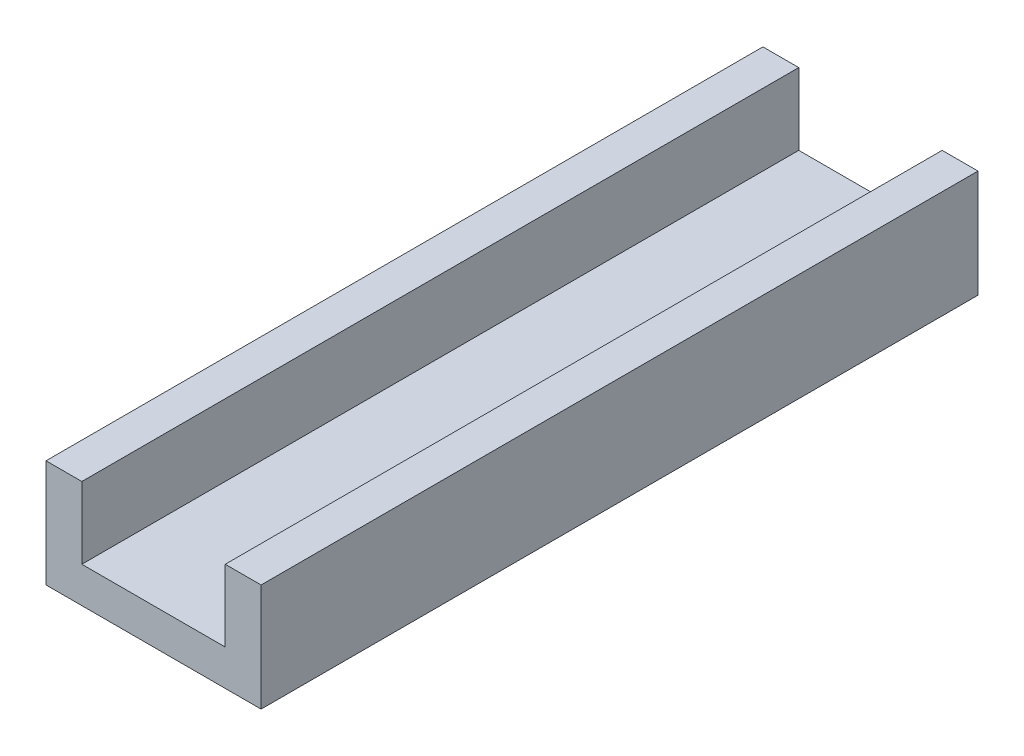
ISO-10303-21;
HEADER;
FILE_DESCRIPTION(('STEP AP214'),'2;1');
FILE_NAME('part.step','',(''),(''),'','','');
FILE_SCHEMA(('AUTOMOTIVE_DESIGN { 1 0 10303 214 1 1 1 1 }'));
ENDSEC;
DATA;
#1=APPLICATION_CONTEXT('core data for automotive mechanical design processes');
#2=APPLICATION_PROTOCOL_DEFINITION('international standard','automotive_design',2000,#1);
#3=PRODUCT_CONTEXT('',#1,'mechanical');
#4=PRODUCT('Part','Part','',(#3));
#5=PRODUCT_RELATED_PRODUCT_CATEGORY('part','',(#4));
#6=PRODUCT_DEFINITION_FORMATION('','',#4);
#7=PRODUCT_DEFINITION_CONTEXT('part definition',#1,'design');
#8=PRODUCT_DEFINITION('design','',#6,#7);
#9=PRODUCT_DEFINITION_SHAPE('','',#8);
#10=(LENGTH_UNIT() NAMED_UNIT(*) SI_UNIT(.MILLI.,.METRE.));
#11=(NAMED_UNIT(*) PLANE_ANGLE_UNIT() SI_UNIT($,.RADIAN.));
#12=(NAMED_UNIT(*) SI_UNIT($,.STERADIAN.) SOLID_ANGLE_UNIT());
#13=UNCERTAINTY_MEASURE_WITH_UNIT(LENGTH_MEASURE(1.E-05),#10,'distance_accuracy_value','');
#14=(GEOMETRIC_REPRESENTATION_CONTEXT(3) GLOBAL_UNCERTAINTY_ASSIGNED_CONTEXT((#13)) GLOBAL_UNIT_ASSIGNED_CONTEXT((#10,
#11,#12)) REPRESENTATION_CONTEXT('',''));
#15=CARTESIAN_POINT('',(0.,0.,0.));
#16=DIRECTION('',(0.,0.,1.));
#17=DIRECTION('',(1.,0.,0.));
#18=AXIS2_PLACEMENT_3D('',#15,#16,#17);
#19=CARTESIAN_POINT('',(60.,0.,200.));
#20=DIRECTION('',(-1.,0.,0.));
#21=DIRECTION('',(0.,0.,1.));
#22=AXIS2_PLACEMENT_3D('',#19,#20,#21);
#23=PLANE('',#22);
#24=DIRECTION('',(0.,1.,0.));
#25=VECTOR('',#24,1.);
#26=CARTESIAN_POINT('',(60.,0.,0.));
#27=LINE('',#26,#25);
#28=CARTESIAN_POINT('',(60.,0.,0.));
#29=VERTEX_POINT('',#28);
#30=CARTESIAN_POINT('',(60.,30.,0.));
#31=VERTEX_POINT('',#30);
#32=EDGE_CURVE('E130',#29,#31,#27,.T.);
#33=ORIENTED_EDGE('',*,*,#32,.T.);
#34=DIRECTION('',(0.,0.,-1.));
#35=VECTOR('',#34,1.);
#36=CARTESIAN_POINT('',(60.,30.,200.));
#37=LINE('',#36,#35);
#38=CARTESIAN_POINT('',(60.,30.,200.));
#39=VERTEX_POINT('',#38);
#40=EDGE_CURVE('E11',#39,#31,#37,.T.);
#41=ORIENTED_EDGE('',*,*,#40,.F.);
#42=DIRECTION('',(0.,1.,0.));
#43=VECTOR('',#42,1.);
#44=CARTESIAN_POINT('',(60.,0.,200.));
#45=LINE('',#44,#43);
#46=CARTESIAN_POINT('',(60.,0.,200.));
#47=VERTEX_POINT('',#46);
#48=EDGE_CURVE('E88',#47,#39,#45,.T.);
#49=ORIENTED_EDGE('',*,*,#48,.F.);
#50=DIRECTION('',(0.,0.,-1.));
#51=VECTOR('',#50,1.);
#52=CARTESIAN_POINT('',(60.,0.,200.));
#53=LINE('',#52,#51);
#54=EDGE_CURVE('E129',#47,#29,#53,.T.);
#55=ORIENTED_EDGE('',*,*,#54,.T.);
#56=EDGE_LOOP('',(#33,#41,#49,#55));
#57=FACE_BOUND('',#56,.T.);
#58=ADVANCED_FACE('F33',(#57),#23,.F.);
#59=CARTESIAN_POINT('',(50.,30.,200.));
#60=DIRECTION('',(0.,1.,0.));
#61=DIRECTION('',(0.,0.,1.));
#62=AXIS2_PLACEMENT_3D('',#59,#60,#61);
#63=PLANE('',#62);
#64=DIRECTION('',(1.,0.,0.));
#65=VECTOR('',#64,1.);
#66=CARTESIAN_POINT('',(50.,30.,0.));
#67=LINE('',#66,#65);
#68=CARTESIAN_POINT('',(50.,30.,0.));
#69=VERTEX_POINT('',#68);
#70=EDGE_CURVE('E133',#69,#31,#67,.T.);
#71=ORIENTED_EDGE('',*,*,#70,.F.);
#72=DIRECTION('',(0.,0.,-1.));
#73=VECTOR('',#72,1.);
#74=CARTESIAN_POINT('',(50.,30.,200.));
#75=LINE('',#74,#73);
#76=CARTESIAN_POINT('',(50.,30.,200.));
#77=VERTEX_POINT('',#76);
#78=EDGE_CURVE('E41',#77,#69,#75,.T.);
#79=ORIENTED_EDGE('',*,*,#78,.F.);
#80=DIRECTION('',(1.,0.,0.));
#81=VECTOR('',#80,1.);
#82=CARTESIAN_POINT('',(50.,30.,200.));
#83=LINE('',#82,#81);
#84=EDGE_CURVE('E172',#77,#39,#83,.T.);
#85=ORIENTED_EDGE('',*,*,#84,.T.);
#86=ORIENTED_EDGE('',*,*,#40,.T.);
#87=EDGE_LOOP('',(#71,#79,#85,#86));
#88=FACE_BOUND('',#87,.T.);
#89=ADVANCED_FACE('F163',(#88),#63,.T.);
#90=CARTESIAN_POINT('',(50.,0.,200.));
#91=DIRECTION('',(-1.,0.,0.));
#92=DIRECTION('',(0.,0.,1.));
#93=AXIS2_PLACEMENT_3D('',#90,#91,#92);
#94=PLANE('',#93);
#95=DIRECTION('',(0.,1.,0.));
#96=VECTOR('',#95,1.);
#97=CARTESIAN_POINT('',(50.,0.,0.));
#98=LINE('',#97,#96);
#99=CARTESIAN_POINT('',(50.,10.,0.));
#100=VERTEX_POINT('',#99);
#101=EDGE_CURVE('E136',#100,#69,#98,.T.);
#102=ORIENTED_EDGE('',*,*,#101,.F.);
#103=DIRECTION('',(0.,0.,-1.));
#104=VECTOR('',#103,1.);
#105=CARTESIAN_POINT('',(50.,10.,200.));
#106=LINE('',#105,#104);
#107=CARTESIAN_POINT('',(50.,10.,200.));
#108=VERTEX_POINT('',#107);
#109=EDGE_CURVE('E153',#108,#100,#106,.T.);
#110=ORIENTED_EDGE('',*,*,#109,.F.);
#111=DIRECTION('',(0.,1.,0.));
#112=VECTOR('',#111,1.);
#113=CARTESIAN_POINT('',(50.,0.,200.));
#114=LINE('',#113,#112);
#115=EDGE_CURVE('E160',#108,#77,#114,.T.);
#116=ORIENTED_EDGE('',*,*,#115,.T.);
#117=ORIENTED_EDGE('',*,*,#78,.T.);
#118=EDGE_LOOP('',(#102,#110,#116,#117));
#119=FACE_BOUND('',#118,.T.);
#120=ADVANCED_FACE('F158',(#119),#94,.T.);
#121=CARTESIAN_POINT('',(0.,10.,200.));
#122=DIRECTION('',(0.,1.,0.));
#123=DIRECTION('',(0.,0.,1.));
#124=AXIS2_PLACEMENT_3D('',#121,#122,#123);
#125=PLANE('',#124);
#126=DIRECTION('',(1.,0.,0.));
#127=VECTOR('',#126,1.);
#128=CARTESIAN_POINT('',(0.,10.,0.));
#129=LINE('',#128,#127);
#130=CARTESIAN_POINT('',(10.,10.,0.));
#131=VERTEX_POINT('',#130);
#132=EDGE_CURVE('E139',#131,#100,#129,.T.);
#133=ORIENTED_EDGE('',*,*,#132,.F.);
#134=DIRECTION('',(0.,0.,-1.));
#135=VECTOR('',#134,1.);
#136=CARTESIAN_POINT('',(10.,10.,200.));
#137=LINE('',#136,#135);
#138=CARTESIAN_POINT('',(10.,10.,200.));
#139=VERTEX_POINT('',#138);
#140=EDGE_CURVE('E151',#139,#131,#137,.T.);
#141=ORIENTED_EDGE('',*,*,#140,.F.);
#142=DIRECTION('',(1.,0.,0.));
#143=VECTOR('',#142,1.);
#144=CARTESIAN_POINT('',(0.,10.,200.));
#145=LINE('',#144,#143);
#146=EDGE_CURVE('E124',#139,#108,#145,.T.);
#147=ORIENTED_EDGE('',*,*,#146,.T.);
#148=ORIENTED_EDGE('',*,*,#109,.T.);
#149=EDGE_LOOP('',(#133,#141,#147,#148));
#150=FACE_BOUND('',#149,.T.);
#151=ADVANCED_FACE('F170',(#150),#125,.T.);
#152=CARTESIAN_POINT('',(10.,30.,200.));
#153=DIRECTION('',(1.,0.,0.));
#154=DIRECTION('',(0.,1.,0.));
#155=AXIS2_PLACEMENT_3D('',#152,#153,#154);
#156=PLANE('',#155);
#157=DIRECTION('',(0.,-1.,0.));
#158=VECTOR('',#157,1.);
#159=CARTESIAN_POINT('',(10.,30.,0.));
#160=LINE('',#159,#158);
#161=CARTESIAN_POINT('',(10.,30.,0.));
#162=VERTEX_POINT('',#161);
#163=EDGE_CURVE('E142',#162,#131,#160,.T.);
#164=ORIENTED_EDGE('',*,*,#163,.F.);
#165=DIRECTION('',(0.,0.,-1.));
#166=VECTOR('',#165,1.);
#167=CARTESIAN_POINT('',(10.,30.,200.));
#168=LINE('',#167,#166);
#169=CARTESIAN_POINT('',(10.,30.,200.));
#170=VERTEX_POINT('',#169);
#171=EDGE_CURVE('E112',#170,#162,#168,.T.);
#172=ORIENTED_EDGE('',*,*,#171,.F.);
#173=DIRECTION('',(0.,-1.,0.));
#174=VECTOR('',#173,1.);
#175=CARTESIAN_POINT('',(10.,30.,200.));
#176=LINE('',#175,#174);
#177=EDGE_CURVE('E122',#170,#139,#176,.T.);
#178=ORIENTED_EDGE('',*,*,#177,.T.);
#179=ORIENTED_EDGE('',*,*,#140,.T.);
#180=EDGE_LOOP('',(#164,#172,#178,#179));
#181=FACE_BOUND('',#180,.T.);
#182=ADVANCED_FACE('F177',(#181),#156,.T.);
#183=CARTESIAN_POINT('',(0.,30.,200.));
#184=DIRECTION('',(0.,1.,0.));
#185=DIRECTION('',(0.,0.,1.));
#186=AXIS2_PLACEMENT_3D('',#183,#184,#185);
#187=PLANE('',#186);
#188=DIRECTION('',(1.,0.,0.));
#189=VECTOR('',#188,1.);
#190=CARTESIAN_POINT('',(0.,30.,0.));
#191=LINE('',#190,#189);
#192=CARTESIAN_POINT('',(0.,30.,0.));
#193=VERTEX_POINT('',#192);
#194=EDGE_CURVE('E111',#193,#162,#191,.T.);
#195=ORIENTED_EDGE('',*,*,#194,.F.);
#196=DIRECTION('',(0.,0.,-1.));
#197=VECTOR('',#196,1.);
#198=CARTESIAN_POINT('',(0.,30.,200.));
#199=LINE('',#198,#197);
#200=CARTESIAN_POINT('',(0.,30.,200.));
#201=VERTEX_POINT('',#200);
#202=EDGE_CURVE('E105',#201,#193,#199,.T.);
#203=ORIENTED_EDGE('',*,*,#202,.F.);
#204=DIRECTION('',(1.,0.,0.));
#205=VECTOR('',#204,1.);
#206=CARTESIAN_POINT('',(0.,30.,200.));
#207=LINE('',#206,#205);
#208=EDGE_CURVE('E109',#201,#170,#207,.T.);
#209=ORIENTED_EDGE('',*,*,#208,.T.);
#210=ORIENTED_EDGE('',*,*,#171,.T.);
#211=EDGE_LOOP('',(#195,#203,#209,#210));
#212=FACE_BOUND('',#211,.T.);
#213=ADVANCED_FACE('F107',(#212),#187,.T.);
#214=CARTESIAN_POINT('',(0.,30.,200.));
#215=DIRECTION('',(1.,0.,0.));
#216=DIRECTION('',(0.,1.,0.));
#217=AXIS2_PLACEMENT_3D('',#214,#215,#216);
#218=PLANE('',#217);
#219=DIRECTION('',(0.,-1.,0.));
#220=VECTOR('',#219,1.);
#221=CARTESIAN_POINT('',(0.,30.,0.));
#222=LINE('',#221,#220);
#223=CARTESIAN_POINT('',(0.,0.,0.));
#224=VERTEX_POINT('',#223);
#225=EDGE_CURVE('E76',#193,#224,#222,.T.);
#226=ORIENTED_EDGE('',*,*,#225,.T.);
#227=DIRECTION('',(0.,0.,-1.));
#228=VECTOR('',#227,1.);
#229=CARTESIAN_POINT('',(0.,0.,200.));
#230=LINE('',#229,#228);
#231=CARTESIAN_POINT('',(0.,0.,200.));
#232=VERTEX_POINT('',#231);
#233=EDGE_CURVE('E113',#232,#224,#230,.T.);
#234=ORIENTED_EDGE('',*,*,#233,.F.);
#235=DIRECTION('',(0.,-1.,0.));
#236=VECTOR('',#235,1.);
#237=CARTESIAN_POINT('',(0.,30.,200.));
#238=LINE('',#237,#236);
#239=EDGE_CURVE('E115',#201,#232,#238,.T.);
#240=ORIENTED_EDGE('',*,*,#239,.F.);
#241=ORIENTED_EDGE('',*,*,#202,.T.);
#242=EDGE_LOOP('',(#226,#234,#240,#241));
#243=FACE_BOUND('',#242,.T.);
#244=ADVANCED_FACE('F116',(#243),#218,.F.);
#245=CARTESIAN_POINT('',(0.,0.,200.));
#246=DIRECTION('',(0.,1.,0.));
#247=DIRECTION('',(0.,0.,1.));
#248=AXIS2_PLACEMENT_3D('',#245,#246,#247);
#249=PLANE('',#248);
#250=DIRECTION('',(1.,0.,0.));
#251=VECTOR('',#250,1.);
#252=CARTESIAN_POINT('',(0.,0.,0.));
#253=LINE('',#252,#251);
#254=EDGE_CURVE('E82',#224,#29,#253,.T.);
#255=ORIENTED_EDGE('',*,*,#254,.T.);
#256=ORIENTED_EDGE('',*,*,#54,.F.);
#257=DIRECTION('',(1.,0.,0.));
#258=VECTOR('',#257,1.);
#259=CARTESIAN_POINT('',(0.,0.,200.));
#260=LINE('',#259,#258);
#261=EDGE_CURVE('E49',#232,#47,#260,.T.);
#262=ORIENTED_EDGE('',*,*,#261,.F.);
#263=ORIENTED_EDGE('',*,*,#233,.T.);
#264=EDGE_LOOP('',(#255,#256,#262,#263));
#265=FACE_BOUND('',#264,.T.);
#266=ADVANCED_FACE('F179',(#265),#249,.F.);
#267=CARTESIAN_POINT('',(0.,0.,200.));
#268=DIRECTION('',(0.,0.,-1.));
#269=DIRECTION('',(-1.,0.,0.));
#270=AXIS2_PLACEMENT_3D('',#267,#268,#269);
#271=PLANE('',#270);
#272=ORIENTED_EDGE('',*,*,#48,.T.);
#273=ORIENTED_EDGE('',*,*,#84,.F.);
#274=ORIENTED_EDGE('',*,*,#115,.F.);
#275=ORIENTED_EDGE('',*,*,#146,.F.);
#276=ORIENTED_EDGE('',*,*,#177,.F.);
#277=ORIENTED_EDGE('',*,*,#208,.F.);
#278=ORIENTED_EDGE('',*,*,#239,.T.);
#279=ORIENTED_EDGE('',*,*,#261,.T.);
#280=EDGE_LOOP('',(#272,#273,#274,#275,#276,#277,#278,#279));
#281=FACE_BOUND('',#280,.T.);
#282=ADVANCED_FACE('F119',(#281),#271,.F.);
#283=CARTESIAN_POINT('',(0.,0.,0.));
#284=DIRECTION('',(0.,0.,-1.));
#285=DIRECTION('',(-1.,0.,0.));
#286=AXIS2_PLACEMENT_3D('',#283,#284,#285);
#287=PLANE('',#286);
#288=ORIENTED_EDGE('',*,*,#32,.F.);
#289=ORIENTED_EDGE('',*,*,#254,.F.);
#290=ORIENTED_EDGE('',*,*,#225,.F.);
#291=ORIENTED_EDGE('',*,*,#194,.T.);
#292=ORIENTED_EDGE('',*,*,#163,.T.);
#293=ORIENTED_EDGE('',*,*,#132,.T.);
#294=ORIENTED_EDGE('',*,*,#101,.T.);
#295=ORIENTED_EDGE('',*,*,#70,.T.);
#296=EDGE_LOOP('',(#288,#289,#290,#291,#292,#293,#294,#295));
#297=FACE_BOUND('',#296,.T.);
#298=ADVANCED_FACE('F166',(#297),#287,.T.);
#299=CLOSED_SHELL('',(#58,#89,#120,#151,#182,#213,#244,#266,#282,#298));
#300=MANIFOLD_SOLID_BREP('B2',#299);
#301=ADVANCED_BREP_SHAPE_REPRESENTATION('',(#18,#300),#14);
#302=SHAPE_DEFINITION_REPRESENTATION(#9,#301);
ENDSEC;
END-ISO-10303-21;
